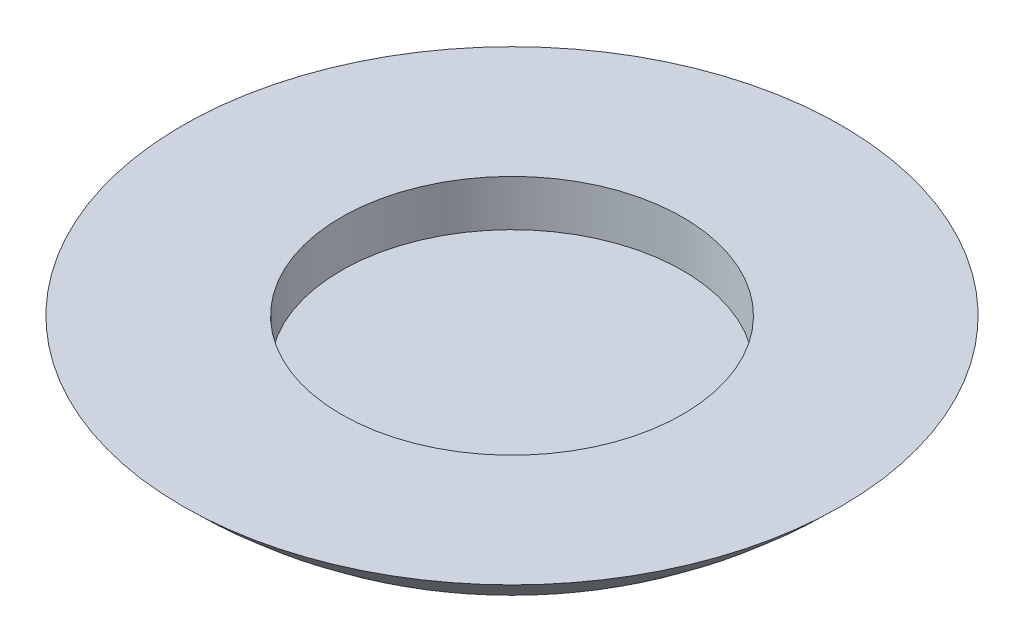
ISO-10303-21;
HEADER;
FILE_DESCRIPTION(('STEP AP214'),'2;1');
FILE_NAME('part.step','',(''),(''),'','','');
FILE_SCHEMA(('AUTOMOTIVE_DESIGN { 1 0 10303 214 1 1 1 1 }'));
ENDSEC;
DATA;
#1=APPLICATION_CONTEXT('core data for automotive mechanical design processes');
#2=APPLICATION_PROTOCOL_DEFINITION('international standard','automotive_design',2000,#1);
#3=PRODUCT_CONTEXT('',#1,'mechanical');
#4=PRODUCT('Part','Part','',(#3));
#5=PRODUCT_RELATED_PRODUCT_CATEGORY('part','',(#4));
#6=PRODUCT_DEFINITION_FORMATION('','',#4);
#7=PRODUCT_DEFINITION_CONTEXT('part definition',#1,'design');
#8=PRODUCT_DEFINITION('design','',#6,#7);
#9=PRODUCT_DEFINITION_SHAPE('','',#8);
#10=(LENGTH_UNIT() NAMED_UNIT(*) SI_UNIT(.MILLI.,.METRE.));
#11=(NAMED_UNIT(*) PLANE_ANGLE_UNIT() SI_UNIT($,.RADIAN.));
#12=(NAMED_UNIT(*) SI_UNIT($,.STERADIAN.) SOLID_ANGLE_UNIT());
#13=UNCERTAINTY_MEASURE_WITH_UNIT(LENGTH_MEASURE(1.E-05),#10,'distance_accuracy_value','');
#14=(GEOMETRIC_REPRESENTATION_CONTEXT(3) GLOBAL_UNCERTAINTY_ASSIGNED_CONTEXT((#13)) GLOBAL_UNIT_ASSIGNED_CONTEXT((#10,
#11,#12)) REPRESENTATION_CONTEXT('',''));
#15=CARTESIAN_POINT('',(0.,0.,0.));
#16=DIRECTION('',(0.,0.,1.));
#17=DIRECTION('',(1.,0.,0.));
#18=AXIS2_PLACEMENT_3D('',#15,#16,#17);
#19=CARTESIAN_POINT('',(0.,0.,0.));
#20=DIRECTION('',(0.,1.,0.));
#21=DIRECTION('',(1.,0.,0.));
#22=AXIS2_PLACEMENT_3D('',#19,#20,#21);
#23=SPHERICAL_SURFACE('',#22,10000.);
#24=CARTESIAN_POINT('',(0.,-7000.,0.));
#25=DIRECTION('',(0.,1.,0.));
#26=DIRECTION('',(0.,0.,1.));
#27=AXIS2_PLACEMENT_3D('',#24,#25,#26);
#28=CIRCLE('',#27,7141.42842854285);
#29=CARTESIAN_POINT('',(0.,-7000.,7141.42842854285));
#30=VERTEX_POINT('',#29);
#31=EDGE_CURVE('E10',#30,#30,#28,.T.);
#32=ORIENTED_EDGE('',*,*,#31,.F.);
#33=EDGE_LOOP('',(#32));
#34=FACE_BOUND('',#33,.T.);
#35=ADVANCED_FACE('F43',(#34),#23,.T.);
#36=CARTESIAN_POINT('',(1.71450551880629E-12,-7000.,0.));
#37=DIRECTION('',(0.,-1.,0.));
#38=DIRECTION('',(0.,0.,-1.));
#39=AXIS2_PLACEMENT_3D('',#36,#37,#38);
#40=PLANE('',#39);
#41=CARTESIAN_POINT('',(0.,-7000.,0.));
#42=DIRECTION('',(0.,1.,0.));
#43=DIRECTION('',(0.,0.,1.));
#44=AXIS2_PLACEMENT_3D('',#41,#42,#43);
#45=CIRCLE('',#44,3700.);
#46=CARTESIAN_POINT('',(0.,-7000.,3700.));
#47=VERTEX_POINT('',#46);
#48=EDGE_CURVE('E55',#47,#47,#45,.T.);
#49=ORIENTED_EDGE('',*,*,#48,.F.);
#50=EDGE_LOOP('',(#49));
#51=FACE_BOUND('',#50,.T.);
#52=ORIENTED_EDGE('',*,*,#31,.T.);
#53=EDGE_LOOP('',(#52));
#54=FACE_BOUND('',#53,.T.);
#55=ADVANCED_FACE('F65',(#51,#54),#40,.F.);
#56=CARTESIAN_POINT('',(0.,-8000.,0.));
#57=DIRECTION('',(0.,1.,0.));
#58=DIRECTION('',(0.,0.,1.));
#59=AXIS2_PLACEMENT_3D('',#56,#57,#58);
#60=CYLINDRICAL_SURFACE('',#59,3700.);
#61=CARTESIAN_POINT('',(0.,-8000.,0.));
#62=DIRECTION('',(0.,1.,0.));
#63=DIRECTION('',(0.,0.,1.));
#64=AXIS2_PLACEMENT_3D('',#61,#62,#63);
#65=CIRCLE('',#64,3700.);
#66=CARTESIAN_POINT('',(0.,-8000.,3700.));
#67=VERTEX_POINT('',#66);
#68=EDGE_CURVE('E50',#67,#67,#65,.T.);
#69=ORIENTED_EDGE('',*,*,#68,.F.);
#70=EDGE_LOOP('',(#69));
#71=FACE_BOUND('',#70,.T.);
#72=ORIENTED_EDGE('',*,*,#48,.T.);
#73=EDGE_LOOP('',(#72));
#74=FACE_BOUND('',#73,.T.);
#75=ADVANCED_FACE('F63',(#71,#74),#60,.F.);
#76=CARTESIAN_POINT('',(0.,-8000.,0.));
#77=DIRECTION('',(0.,1.,0.));
#78=DIRECTION('',(0.,0.,1.));
#79=AXIS2_PLACEMENT_3D('',#76,#77,#78);
#80=PLANE('',#79);
#81=ORIENTED_EDGE('',*,*,#68,.T.);
#82=EDGE_LOOP('',(#81));
#83=FACE_BOUND('',#82,.T.);
#84=ADVANCED_FACE('F71',(#83),#80,.T.);
#85=CLOSED_SHELL('',(#35,#55,#75,#84));
#86=MANIFOLD_SOLID_BREP('B2',#85);
#87=ADVANCED_BREP_SHAPE_REPRESENTATION('',(#18,#86),#14);
#88=SHAPE_DEFINITION_REPRESENTATION(#9,#87);
ENDSEC;
END-ISO-10303-21;
